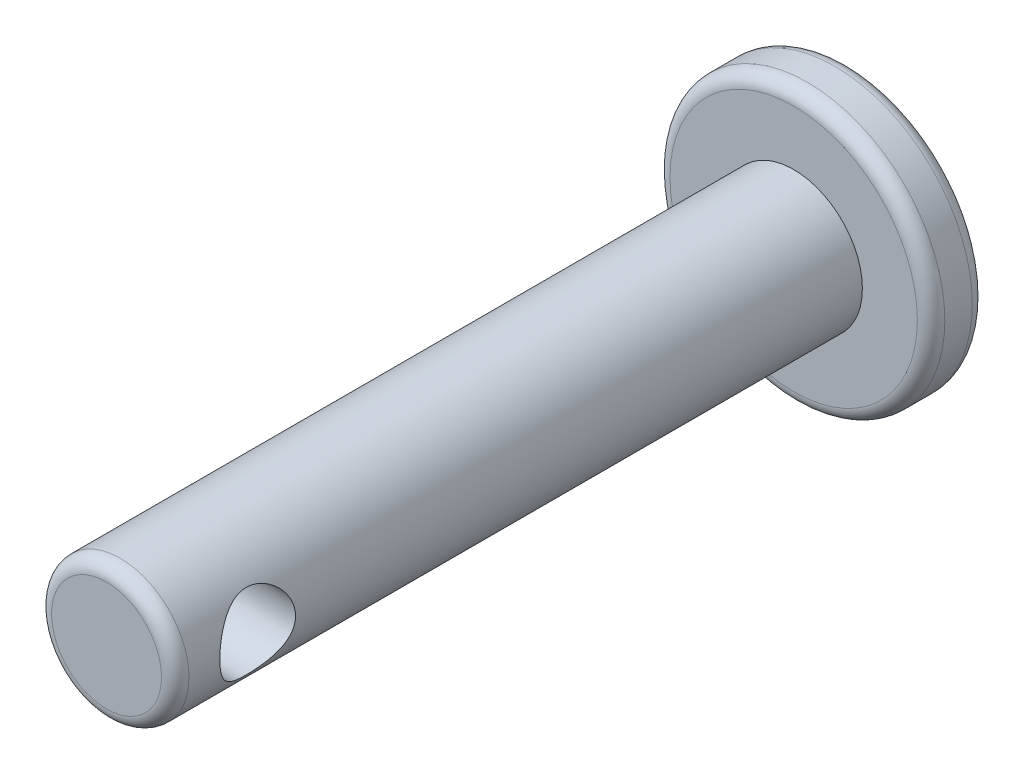
ISO-10303-21;
HEADER;
FILE_DESCRIPTION(('STEP AP214'),'2;1');
FILE_NAME('part.step','',(''),(''),'','','');
FILE_SCHEMA(('AUTOMOTIVE_DESIGN { 1 0 10303 214 1 1 1 1 }'));
ENDSEC;
DATA;
#1=APPLICATION_CONTEXT('core data for automotive mechanical design processes');
#2=APPLICATION_PROTOCOL_DEFINITION('international standard','automotive_design',2000,#1);
#3=PRODUCT_CONTEXT('',#1,'mechanical');
#4=PRODUCT('Part','Part','',(#3));
#5=PRODUCT_RELATED_PRODUCT_CATEGORY('part','',(#4));
#6=PRODUCT_DEFINITION_FORMATION('','',#4);
#7=PRODUCT_DEFINITION_CONTEXT('part definition',#1,'design');
#8=PRODUCT_DEFINITION('design','',#6,#7);
#9=PRODUCT_DEFINITION_SHAPE('','',#8);
#10=(LENGTH_UNIT() NAMED_UNIT(*) SI_UNIT(.MILLI.,.METRE.));
#11=(NAMED_UNIT(*) PLANE_ANGLE_UNIT() SI_UNIT($,.RADIAN.));
#12=(NAMED_UNIT(*) SI_UNIT($,.STERADIAN.) SOLID_ANGLE_UNIT());
#13=UNCERTAINTY_MEASURE_WITH_UNIT(LENGTH_MEASURE(1.E-05),#10,'distance_accuracy_value','');
#14=(GEOMETRIC_REPRESENTATION_CONTEXT(3) GLOBAL_UNCERTAINTY_ASSIGNED_CONTEXT((#13)) GLOBAL_UNIT_ASSIGNED_CONTEXT((#10,
#11,#12)) REPRESENTATION_CONTEXT('',''));
#15=CARTESIAN_POINT('',(0.,0.,0.));
#16=DIRECTION('',(0.,0.,1.));
#17=DIRECTION('',(1.,0.,0.));
#18=AXIS2_PLACEMENT_3D('',#15,#16,#17);
#19=CARTESIAN_POINT('',(0.,0.,31.75));
#20=DIRECTION('',(0.,0.,-1.));
#21=DIRECTION('',(-1.,0.,0.));
#22=AXIS2_PLACEMENT_3D('',#19,#20,#21);
#23=CYLINDRICAL_SURFACE('',#22,3.175);
#24=CARTESIAN_POINT('',(0.,0.,31.115));
#25=DIRECTION('',(0.,0.,1.));
#26=DIRECTION('',(1.,0.,0.));
#27=AXIS2_PLACEMENT_3D('',#24,#25,#26);
#28=CIRCLE('',#27,3.175);
#29=CARTESIAN_POINT('',(3.175,0.,31.115));
#30=VERTEX_POINT('',#29);
#31=EDGE_CURVE('E66',#30,#30,#28,.F.);
#32=ORIENTED_EDGE('',*,*,#31,.T.);
#33=EDGE_LOOP('',(#32));
#34=FACE_BOUND('',#33,.T.);
#35=CARTESIAN_POINT('',(-3.175,0.,29.69));
#36=CARTESIAN_POINT('',(-3.17499486148875,-0.0908343345345119,29.6899943142266));
#37=CARTESIAN_POINT('',(-3.17106237894338,-0.181741129095554,29.6828870197443));
#38=CARTESIAN_POINT('',(-3.15571837285608,-0.360794949485811,29.6548079730322));
#39=CARTESIAN_POINT('',(-3.14429673894018,-0.448938075564867,29.6338174781116));
#40=CARTESIAN_POINT('',(-3.11515124844675,-0.61961748666571,29.5790775292153));
#41=CARTESIAN_POINT('',(-3.09745340852565,-0.702175267011816,29.5453807105987));
#42=CARTESIAN_POINT('',(-3.05731508680075,-0.8602986592527,29.4664997517663));
#43=CARTESIAN_POINT('',(-3.03487439009447,-0.935863954089451,29.4213150910088));
#44=CARTESIAN_POINT('',(-2.98540925415886,-1.08371813160088,29.3172378223179));
#45=CARTESIAN_POINT('',(-2.95817540815769,-1.15542146387072,29.2576146474918));
#46=CARTESIAN_POINT('',(-2.90274653800907,-1.28836534351099,29.1279603481617));
#47=CARTESIAN_POINT('',(-2.8745506407085,-1.34959606574723,29.0579195640296));
#48=CARTESIAN_POINT('',(-2.81711347517585,-1.4659849714629,28.9011638574697));
#49=CARTESIAN_POINT('',(-2.78804528999922,-1.51994094194641,28.8134845250422));
#50=CARTESIAN_POINT('',(-2.73577622635886,-1.61213438096743,28.6285987648875));
#51=CARTESIAN_POINT('',(-2.71257071248348,-1.65038428280926,28.5313999488065));
#52=CARTESIAN_POINT('',(-2.67705484742213,-1.70735882688387,28.336328138979));
#53=CARTESIAN_POINT('',(-2.66414870738661,-1.72716450718922,28.2388858307223));
#54=CARTESIAN_POINT('',(-2.64929052379462,-1.74988358962694,28.0412849151578));
#55=CARTESIAN_POINT('',(-2.64732263124576,-1.75282143264469,27.9411304493474));
#56=CARTESIAN_POINT('',(-2.65410847820901,-1.74250953145329,27.7575279009294));
#57=CARTESIAN_POINT('',(-2.66126742374306,-1.73166839699995,27.6738688786424));
#58=CARTESIAN_POINT('',(-2.68263930216934,-1.6983696372325,27.5098272468928));
#59=CARTESIAN_POINT('',(-2.6968554769326,-1.67590667301184,27.4294461615931));
#60=CARTESIAN_POINT('',(-2.73098075921813,-1.61971069833494,27.2720337302982));
#61=CARTESIAN_POINT('',(-2.75100558760618,-1.58574597984232,27.195111418245));
#62=CARTESIAN_POINT('',(-2.79453478821848,-1.50771194619491,27.0476598054472));
#63=CARTESIAN_POINT('',(-2.81804065711077,-1.46363828021824,26.9771332756938));
#64=CARTESIAN_POINT('',(-2.87036597590955,-1.35852443625878,26.8327050359635));
#65=CARTESIAN_POINT('',(-2.89943694549374,-1.2959020684127,26.7600415879745));
#66=CARTESIAN_POINT('',(-2.95666921389051,-1.15940252909128,26.6256690662816));
#67=CARTESIAN_POINT('',(-2.98482987458003,-1.08551766148893,26.5639675462257));
#68=CARTESIAN_POINT('',(-3.0393649497108,-0.922368510349789,26.4492512620687));
#69=CARTESIAN_POINT('',(-3.06548977971676,-0.832402073084931,26.3971061304843));
#70=CARTESIAN_POINT('',(-3.11068497528208,-0.64318779398813,26.3091524507632));
#71=CARTESIAN_POINT('',(-3.12976199333834,-0.543948816052225,26.2733284894297));
#72=CARTESIAN_POINT('',(-3.15716082660671,-0.348908087964604,26.2224576302459));
#73=CARTESIAN_POINT('',(-3.16632047200006,-0.253650417076915,26.2057832277806));
#74=CARTESIAN_POINT('',(-3.1758654689012,-0.0612742076771245,26.1884137798865));
#75=CARTESIAN_POINT('',(-3.17625646716767,0.0358430929493048,26.1877084508271));
#76=CARTESIAN_POINT('',(-3.16863544823089,0.218973549595897,26.2015673489631));
#77=CARTESIAN_POINT('',(-3.16144517726059,0.305140280995927,26.2146382884209));
#78=CARTESIAN_POINT('',(-3.14059426840164,0.473832649268518,26.253148181577));
#79=CARTESIAN_POINT('',(-3.12693297737247,0.556357917677371,26.2785883837508));
#80=CARTESIAN_POINT('',(-3.09395511583406,0.717633813051058,26.3415114720942));
#81=CARTESIAN_POINT('',(-3.07451936269971,0.796259428096028,26.3792499639206));
#82=CARTESIAN_POINT('',(-3.0317156607883,0.94626570658803,26.4653577779123));
#83=CARTESIAN_POINT('',(-3.00834628302915,1.01764372201146,26.5137309653438));
#84=CARTESIAN_POINT('',(-2.95670949787944,1.15966503521653,26.6259370781459));
#85=CARTESIAN_POINT('',(-2.92818673647069,1.22932677337921,26.6908957770729));
#86=CARTESIAN_POINT('',(-2.87111305374919,1.3572968910084,26.8312708868849));
#87=CARTESIAN_POINT('',(-2.84256213412194,1.4155933429475,26.9066981436482));
#88=CARTESIAN_POINT('',(-2.78622625826442,1.52366886261597,27.0730931567083));
#89=CARTESIAN_POINT('',(-2.75867708376229,1.57242103564493,27.1648158399857));
#90=CARTESIAN_POINT('',(-2.71096594289495,1.65333547859534,27.3570622912219));
#91=CARTESIAN_POINT('',(-2.69079322105002,1.68552193086363,27.4575729782345));
#92=CARTESIAN_POINT('',(-2.66293247092364,1.72917068263101,27.6543249961799));
#93=CARTESIAN_POINT('',(-2.65422471529202,1.74233787768894,27.7500373802096));
#94=CARTESIAN_POINT('',(-2.64743355495655,1.7526470382738,27.9426648026175));
#95=CARTESIAN_POINT('',(-2.64934087980603,1.749802986845,28.0395787178719));
#96=CARTESIAN_POINT('',(-2.66240543812459,1.72983233210212,28.2176543799796));
#97=CARTESIAN_POINT('',(-2.67225802065448,1.71471830731483,28.299153409002));
#98=CARTESIAN_POINT('',(-2.69825190124201,1.67351473896551,28.4582728422434));
#99=CARTESIAN_POINT('',(-2.71439580334841,1.64742065027287,28.535891625355));
#100=CARTESIAN_POINT('',(-2.75231671408327,1.58330034444638,28.6903873343403));
#101=CARTESIAN_POINT('',(-2.77437717183065,1.54464359979401,28.7669304630569));
#102=CARTESIAN_POINT('',(-2.82134382352456,1.45709032279287,28.9129566073278));
#103=CARTESIAN_POINT('',(-2.84625152151811,1.40818836697509,28.9824358544516));
#104=CARTESIAN_POINT('',(-2.90079923116023,1.29255099628502,29.1238131376933));
#105=CARTESIAN_POINT('',(-2.93056594993979,1.22421929245562,29.1943638314129));
#106=CARTESIAN_POINT('',(-2.98810183596612,1.07618754952996,29.3234626149915));
#107=CARTESIAN_POINT('',(-3.01586954889191,0.996479357049844,29.3820020225296));
#108=CARTESIAN_POINT('',(-3.06753456849291,0.824153480581276,29.4871965777234));
#109=CARTESIAN_POINT('',(-3.09125894777407,0.731177300473371,29.5333545945618));
#110=CARTESIAN_POINT('',(-3.13078513350301,0.537155374305828,29.6087509368839));
#111=CARTESIAN_POINT('',(-3.14660717776965,0.436131017842751,29.6380325127567));
#112=CARTESIAN_POINT('',(-3.16326330516402,0.278272899920089,29.6686346155896));
#113=CARTESIAN_POINT('',(-3.16764671881302,0.223024440475059,29.6766288498162));
#114=CARTESIAN_POINT('',(-3.17351662400142,0.111859808204818,29.6873132478769));
#115=CARTESIAN_POINT('',(-3.17500316474007,0.0559436467357987,29.6900035017915));
#116=CARTESIAN_POINT('',(-3.175,0.,29.69));
#117=B_SPLINE_CURVE_WITH_KNOTS('',3,(#35,#36,#37,#38,#39,#40,#41,#42,#43,#44,#45,#46,#47,#48,
#49,#50,#51,#52,#53,#54,#55,#56,#57,#58,#59,#60,#61,#62,#63,#64,#65,#66,#67,#68,#69,#70,#71,#72,
#73,#74,#75,#76,#77,#78,#79,#80,#81,#82,#83,#84,#85,#86,#87,#88,#89,#90,#91,#92,#93,#94,#95,#96,
#97,#98,#99,#100,#101,#102,#103,#104,#105,#106,#107,#108,#109,#110,#111,#112,#113,#114,#115,
#116),.UNSPECIFIED.,.T.,.F.,(4,2,2,2,2,2,2,2,2,2,2,2,2,2,2,2,2,2,2,2,2,2,2,2,2,2,2,2,2,2,2,2,2,
2,2,2,2,2,2,2,4),(0.,0.272277820360698,0.544923975386455,0.816452897336008,1.08799412510768,
1.37826598247638,1.66880868920759,1.98812964124305,2.30719732146529,2.60610381295607,
2.90457709025153,3.15737066351596,3.41028046987245,3.6686225736785,3.92707607549681,
4.2265140987662,4.52615766524984,4.84606499591306,5.16566958678105,5.455435828957,
5.74501546457466,6.00614653400911,6.26730396584558,6.53427814513967,6.80134951925505,
7.09839519446488,7.39575095162455,7.71643302354713,8.03664563214355,8.3258529908513,
8.61480781634001,8.86412808337865,9.11355165670814,9.37818333414945,9.6429554542442,
9.94949416732581,10.2562536863531,10.5739311814169,10.8907908808705,11.058485981829,
11.2261782347014),.UNSPECIFIED.);
#118=CARTESIAN_POINT('',(-3.175,0.,29.69));
#119=VERTEX_POINT('',#118);
#120=EDGE_CURVE('E75',#119,#119,#117,.T.);
#121=ORIENTED_EDGE('',*,*,#120,.T.);
#122=EDGE_LOOP('',(#121));
#123=FACE_BOUND('',#122,.T.);
#124=CARTESIAN_POINT('',(3.175,0.,26.19));
#125=CARTESIAN_POINT('',(3.17499486148875,-0.0908343345345121,26.1900056857734));
#126=CARTESIAN_POINT('',(3.17106237894338,-0.181741129095554,26.1971129802557));
#127=CARTESIAN_POINT('',(3.15571837285608,-0.360794949485811,26.2251920269678));
#128=CARTESIAN_POINT('',(3.14429673894018,-0.448938075564867,26.2461825218884));
#129=CARTESIAN_POINT('',(3.11515124844675,-0.61961748666571,26.3009224707847));
#130=CARTESIAN_POINT('',(3.09745340852565,-0.702175267011816,26.3346192894013));
#131=CARTESIAN_POINT('',(3.05731508680075,-0.8602986592527,26.4135002482337));
#132=CARTESIAN_POINT('',(3.03487439009447,-0.935863954089452,26.4586849089912));
#133=CARTESIAN_POINT('',(2.98540925415886,-1.08371813160089,26.5627621776821));
#134=CARTESIAN_POINT('',(2.95817540815769,-1.15542146387073,26.6223853525082));
#135=CARTESIAN_POINT('',(2.90274653800907,-1.28836534351099,26.7520396518383));
#136=CARTESIAN_POINT('',(2.8745506407085,-1.34959606574723,26.8220804359704));
#137=CARTESIAN_POINT('',(2.81711347517585,-1.4659849714629,26.9788361425303));
#138=CARTESIAN_POINT('',(2.78804528999922,-1.51994094194641,27.0665154749578));
#139=CARTESIAN_POINT('',(2.73577622635886,-1.61213438096743,27.2514012351125));
#140=CARTESIAN_POINT('',(2.71257071248348,-1.65038428280926,27.3486000511935));
#141=CARTESIAN_POINT('',(2.67705484742213,-1.70735882688387,27.543671861021));
#142=CARTESIAN_POINT('',(2.66414870738661,-1.72716450718922,27.6411141692777));
#143=CARTESIAN_POINT('',(2.64929052379462,-1.74988358962694,27.8387150848422));
#144=CARTESIAN_POINT('',(2.64732263124576,-1.75282143264469,27.9388695506526));
#145=CARTESIAN_POINT('',(2.65410847820901,-1.74250953145329,28.1224720990706));
#146=CARTESIAN_POINT('',(2.66126742374306,-1.73166839699995,28.2061311213576));
#147=CARTESIAN_POINT('',(2.68263930216934,-1.6983696372325,28.3701727531072));
#148=CARTESIAN_POINT('',(2.6968554769326,-1.67590667301184,28.4505538384069));
#149=CARTESIAN_POINT('',(2.73098075921813,-1.61971069833494,28.6079662697018));
#150=CARTESIAN_POINT('',(2.75100558760618,-1.58574597984231,28.684888581755));
#151=CARTESIAN_POINT('',(2.79453478821848,-1.50771194619491,28.8323401945528));
#152=CARTESIAN_POINT('',(2.81804065711077,-1.46363828021824,28.9028667243062));
#153=CARTESIAN_POINT('',(2.87036597590955,-1.35852443625878,29.0472949640365));
#154=CARTESIAN_POINT('',(2.89943694549374,-1.2959020684127,29.1199584120255));
#155=CARTESIAN_POINT('',(2.95666921389051,-1.15940252909128,29.2543309337184));
#156=CARTESIAN_POINT('',(2.98482987458003,-1.08551766148893,29.3160324537743));
#157=CARTESIAN_POINT('',(3.0393649497108,-0.922368510349789,29.4307487379313));
#158=CARTESIAN_POINT('',(3.06548977971676,-0.832402073084931,29.4828938695157));
#159=CARTESIAN_POINT('',(3.11068497528208,-0.64318779398813,29.5708475492368));
#160=CARTESIAN_POINT('',(3.12976199333834,-0.543948816052225,29.6066715105703));
#161=CARTESIAN_POINT('',(3.15716082660671,-0.348908087964604,29.6575423697541));
#162=CARTESIAN_POINT('',(3.16632047200006,-0.253650417076915,29.6742167722194));
#163=CARTESIAN_POINT('',(3.1758654689012,-0.0612742076771245,29.6915862201135));
#164=CARTESIAN_POINT('',(3.17625646716767,0.0358430929493048,29.6922915491729));
#165=CARTESIAN_POINT('',(3.16863544823089,0.218973549595897,29.6784326510369));
#166=CARTESIAN_POINT('',(3.16144517726059,0.305140280995927,29.6653617115791));
#167=CARTESIAN_POINT('',(3.14059426840164,0.473832649268518,29.626851818423));
#168=CARTESIAN_POINT('',(3.12693297737247,0.556357917677371,29.6014116162492));
#169=CARTESIAN_POINT('',(3.09395511583406,0.717633813051058,29.5384885279058));
#170=CARTESIAN_POINT('',(3.07451936269971,0.796259428096028,29.5007500360794));
#171=CARTESIAN_POINT('',(3.0317156607883,0.94626570658803,29.4146422220877));
#172=CARTESIAN_POINT('',(3.00834628302915,1.01764372201146,29.3662690346562));
#173=CARTESIAN_POINT('',(2.95670949787944,1.15966503521653,29.2540629218541));
#174=CARTESIAN_POINT('',(2.92818673647069,1.22932677337921,29.1891042229271));
#175=CARTESIAN_POINT('',(2.87111305374919,1.3572968910084,29.0487291131151));
#176=CARTESIAN_POINT('',(2.84256213412194,1.4155933429475,28.9733018563518));
#177=CARTESIAN_POINT('',(2.78622625826442,1.52366886261597,28.8069068432918));
#178=CARTESIAN_POINT('',(2.75867708376229,1.57242103564493,28.7151841600143));
#179=CARTESIAN_POINT('',(2.71096594289495,1.65333547859534,28.5229377087781));
#180=CARTESIAN_POINT('',(2.69079322105002,1.68552193086363,28.4224270217655));
#181=CARTESIAN_POINT('',(2.66293247092364,1.72917068263101,28.2256750038201));
#182=CARTESIAN_POINT('',(2.65422471529202,1.74233787768894,28.1299626197904));
#183=CARTESIAN_POINT('',(2.64743355495655,1.7526470382738,27.9373351973825));
#184=CARTESIAN_POINT('',(2.64934087980602,1.749802986845,27.8404212821281));
#185=CARTESIAN_POINT('',(2.66240543812459,1.72983233210212,27.6623456200204));
#186=CARTESIAN_POINT('',(2.67225802065448,1.71471830731483,27.580846590998));
#187=CARTESIAN_POINT('',(2.69825190124201,1.6735147389655,27.4217271577566));
#188=CARTESIAN_POINT('',(2.71439580334841,1.64742065027287,27.344108374645));
#189=CARTESIAN_POINT('',(2.75231671408327,1.58330034444638,27.1896126656597));
#190=CARTESIAN_POINT('',(2.77437717183065,1.54464359979401,27.1130695369431));
#191=CARTESIAN_POINT('',(2.82134382352456,1.45709032279287,26.9670433926722));
#192=CARTESIAN_POINT('',(2.84625152151811,1.40818836697509,26.8975641455484));
#193=CARTESIAN_POINT('',(2.90079923116023,1.29255099628502,26.7561868623067));
#194=CARTESIAN_POINT('',(2.93056594993979,1.22421929245562,26.6856361685871));
#195=CARTESIAN_POINT('',(2.98810183596612,1.07618754952996,26.5565373850085));
#196=CARTESIAN_POINT('',(3.01586954889191,0.996479357049844,26.4979979774704));
#197=CARTESIAN_POINT('',(3.06753456849291,0.824153480581275,26.3928034222766));
#198=CARTESIAN_POINT('',(3.09125894777407,0.73117730047337,26.3466454054383));
#199=CARTESIAN_POINT('',(3.13078513350301,0.537155374305827,26.2712490631161));
#200=CARTESIAN_POINT('',(3.14660717776965,0.43613101784275,26.2419674872433));
#201=CARTESIAN_POINT('',(3.16326330516402,0.278272899920089,26.2113653844104));
#202=CARTESIAN_POINT('',(3.16764671881302,0.22302444047506,26.2033711501838));
#203=CARTESIAN_POINT('',(3.17351662400142,0.111859808204819,26.1926867521231));
#204=CARTESIAN_POINT('',(3.17500316474007,0.0559436467357989,26.1899964982085));
#205=CARTESIAN_POINT('',(3.175,0.,26.19));
#206=B_SPLINE_CURVE_WITH_KNOTS('',3,(#124,#125,#126,#127,#128,#129,#130,#131,#132,#133,#134,
#135,#136,#137,#138,#139,#140,#141,#142,#143,#144,#145,#146,#147,#148,#149,#150,#151,#152,#153,
#154,#155,#156,#157,#158,#159,#160,#161,#162,#163,#164,#165,#166,#167,#168,#169,#170,#171,#172,
#173,#174,#175,#176,#177,#178,#179,#180,#181,#182,#183,#184,#185,#186,#187,#188,#189,#190,#191,
#192,#193,#194,#195,#196,#197,#198,#199,#200,#201,#202,#203,#204,#205),.UNSPECIFIED.,.T.,.F.,(4,
2,2,2,2,2,2,2,2,2,2,2,2,2,2,2,2,2,2,2,2,2,2,2,2,2,2,2,2,2,2,2,2,2,2,2,2,2,2,2,4),(0.,
0.272277820360698,0.544923975386455,0.816452897336008,1.08799412510768,1.37826598247639,
1.66880868920759,1.98812964124305,2.30719732146529,2.60610381295607,2.90457709025153,
3.15737066351596,3.41028046987245,3.6686225736785,3.92707607549681,4.2265140987662,
4.52615766524984,4.84606499591306,5.16566958678105,5.455435828957,5.74501546457466,
6.00614653400911,6.26730396584558,6.53427814513967,6.80134951925505,7.09839519446488,
7.39575095162455,7.71643302354714,8.03664563214355,8.3258529908513,8.61480781634001,
8.86412808337865,9.11355165670814,9.37818333414944,9.64295545424419,9.9494941673258,
10.2562536863531,10.5739311814169,10.8907908808705,11.058485981829,11.2261782347014),.UNSPECIFIED.);
#207=CARTESIAN_POINT('',(3.175,0.,26.19));
#208=VERTEX_POINT('',#207);
#209=EDGE_CURVE('E84',#208,#208,#206,.T.);
#210=ORIENTED_EDGE('',*,*,#209,.T.);
#211=EDGE_LOOP('',(#210));
#212=FACE_BOUND('',#211,.T.);
#213=CARTESIAN_POINT('',(0.,0.,0.));
#214=DIRECTION('',(0.,0.,1.));
#215=DIRECTION('',(1.,0.,0.));
#216=AXIS2_PLACEMENT_3D('',#213,#214,#215);
#217=CIRCLE('',#216,3.175);
#218=CARTESIAN_POINT('',(3.175,0.,0.));
#219=VERTEX_POINT('',#218);
#220=EDGE_CURVE('E74',#219,#219,#217,.T.);
#221=ORIENTED_EDGE('',*,*,#220,.T.);
#222=EDGE_LOOP('',(#221));
#223=FACE_BOUND('',#222,.T.);
#224=ADVANCED_FACE('F42',(#34,#123,#212,#223),#23,.T.);
#225=CARTESIAN_POINT('',(0.,0.,31.75));
#226=DIRECTION('',(0.,0.,1.));
#227=DIRECTION('',(1.,0.,0.));
#228=AXIS2_PLACEMENT_3D('',#225,#226,#227);
#229=PLANE('',#228);
#230=CARTESIAN_POINT('',(0.,0.,31.75));
#231=DIRECTION('',(0.,0.,1.));
#232=DIRECTION('',(1.,0.,0.));
#233=AXIS2_PLACEMENT_3D('',#230,#231,#232);
#234=CIRCLE('',#233,2.54);
#235=CARTESIAN_POINT('',(2.54,0.,31.75));
#236=VERTEX_POINT('',#235);
#237=EDGE_CURVE('E70',#236,#236,#234,.T.);
#238=ORIENTED_EDGE('',*,*,#237,.T.);
#239=EDGE_LOOP('',(#238));
#240=FACE_BOUND('',#239,.T.);
#241=ADVANCED_FACE('F108',(#240),#229,.T.);
#242=CARTESIAN_POINT('',(0.,0.,-2.54));
#243=DIRECTION('',(0.,0.,1.));
#244=DIRECTION('',(1.,0.,0.));
#245=AXIS2_PLACEMENT_3D('',#242,#243,#244);
#246=CYLINDRICAL_SURFACE('',#245,6.35);
#247=CARTESIAN_POINT('',(0.,0.,-1.905));
#248=DIRECTION('',(0.,0.,-1.));
#249=DIRECTION('',(-1.,0.,0.));
#250=AXIS2_PLACEMENT_3D('',#247,#248,#249);
#251=CIRCLE('',#250,6.35);
#252=CARTESIAN_POINT('',(-6.35,0.,-1.905));
#253=VERTEX_POINT('',#252);
#254=EDGE_CURVE('E50',#253,#253,#251,.F.);
#255=ORIENTED_EDGE('',*,*,#254,.T.);
#256=EDGE_LOOP('',(#255));
#257=FACE_BOUND('',#256,.T.);
#258=CARTESIAN_POINT('',(0.,0.,-0.635));
#259=DIRECTION('',(0.,0.,-1.));
#260=DIRECTION('',(-1.,0.,0.));
#261=AXIS2_PLACEMENT_3D('',#258,#259,#260);
#262=CIRCLE('',#261,6.35);
#263=CARTESIAN_POINT('',(-6.35,0.,-0.635));
#264=VERTEX_POINT('',#263);
#265=EDGE_CURVE('E55',#264,#264,#262,.T.);
#266=ORIENTED_EDGE('',*,*,#265,.T.);
#267=EDGE_LOOP('',(#266));
#268=FACE_BOUND('',#267,.T.);
#269=ADVANCED_FACE('F103',(#257,#268),#246,.T.);
#270=CARTESIAN_POINT('',(0.,0.,-2.54));
#271=DIRECTION('',(0.,0.,-1.));
#272=DIRECTION('',(-1.,0.,0.));
#273=AXIS2_PLACEMENT_3D('',#270,#271,#272);
#274=PLANE('',#273);
#275=CARTESIAN_POINT('',(0.,0.,-2.54));
#276=DIRECTION('',(0.,0.,-1.));
#277=DIRECTION('',(-1.,0.,0.));
#278=AXIS2_PLACEMENT_3D('',#275,#276,#277);
#279=CIRCLE('',#278,5.715);
#280=CARTESIAN_POINT('',(-5.715,0.,-2.54));
#281=VERTEX_POINT('',#280);
#282=EDGE_CURVE('E60',#281,#281,#279,.T.);
#283=ORIENTED_EDGE('',*,*,#282,.T.);
#284=EDGE_LOOP('',(#283));
#285=FACE_BOUND('',#284,.T.);
#286=ADVANCED_FACE('F99',(#285),#274,.T.);
#287=CARTESIAN_POINT('',(0.,0.,0.));
#288=DIRECTION('',(0.,0.,-1.));
#289=DIRECTION('',(-1.,0.,0.));
#290=AXIS2_PLACEMENT_3D('',#287,#288,#289);
#291=PLANE('',#290);
#292=CARTESIAN_POINT('',(0.,0.,0.));
#293=DIRECTION('',(0.,0.,-1.));
#294=DIRECTION('',(-1.,0.,0.));
#295=AXIS2_PLACEMENT_3D('',#292,#293,#294);
#296=CIRCLE('',#295,5.715);
#297=CARTESIAN_POINT('',(-5.715,0.,0.));
#298=VERTEX_POINT('',#297);
#299=EDGE_CURVE('E10',#298,#298,#296,.F.);
#300=ORIENTED_EDGE('',*,*,#299,.T.);
#301=EDGE_LOOP('',(#300));
#302=FACE_BOUND('',#301,.T.);
#303=ORIENTED_EDGE('',*,*,#220,.F.);
#304=EDGE_LOOP('',(#303));
#305=FACE_BOUND('',#304,.T.);
#306=ADVANCED_FACE('F97',(#302,#305),#291,.F.);
#307=CARTESIAN_POINT('',(-6.35,0.,27.94));
#308=DIRECTION('',(1.,0.,0.));
#309=DIRECTION('',(0.,0.,-1.));
#310=AXIS2_PLACEMENT_3D('',#307,#308,#309);
#311=CYLINDRICAL_SURFACE('',#310,1.75);
#312=ORIENTED_EDGE('',*,*,#209,.F.);
#313=EDGE_LOOP('',(#312));
#314=FACE_BOUND('',#313,.T.);
#315=ORIENTED_EDGE('',*,*,#120,.F.);
#316=EDGE_LOOP('',(#315));
#317=FACE_BOUND('',#316,.T.);
#318=ADVANCED_FACE('F92',(#314,#317),#311,.F.);
#319=CARTESIAN_POINT('',(0.,0.,31.115));
#320=DIRECTION('',(0.,0.,1.));
#321=DIRECTION('',(1.,0.,0.));
#322=AXIS2_PLACEMENT_3D('',#319,#320,#321);
#323=TOROIDAL_SURFACE('',#322,2.54,0.635);
#324=ORIENTED_EDGE('',*,*,#31,.F.);
#325=EDGE_LOOP('',(#324));
#326=FACE_BOUND('',#325,.T.);
#327=ORIENTED_EDGE('',*,*,#237,.F.);
#328=EDGE_LOOP('',(#327));
#329=FACE_BOUND('',#328,.T.);
#330=ADVANCED_FACE('F96',(#326,#329),#323,.T.);
#331=CARTESIAN_POINT('',(0.,0.,-1.905));
#332=DIRECTION('',(0.,0.,-1.));
#333=DIRECTION('',(-1.,0.,0.));
#334=AXIS2_PLACEMENT_3D('',#331,#332,#333);
#335=TOROIDAL_SURFACE('',#334,5.715,0.635);
#336=ORIENTED_EDGE('',*,*,#254,.F.);
#337=EDGE_LOOP('',(#336));
#338=FACE_BOUND('',#337,.T.);
#339=ORIENTED_EDGE('',*,*,#282,.F.);
#340=EDGE_LOOP('',(#339));
#341=FACE_BOUND('',#340,.T.);
#342=ADVANCED_FACE('F118',(#338,#341),#335,.T.);
#343=CARTESIAN_POINT('',(0.,0.,-0.635));
#344=DIRECTION('',(0.,0.,-1.));
#345=DIRECTION('',(-1.,0.,0.));
#346=AXIS2_PLACEMENT_3D('',#343,#344,#345);
#347=TOROIDAL_SURFACE('',#346,5.715,0.635);
#348=ORIENTED_EDGE('',*,*,#299,.F.);
#349=EDGE_LOOP('',(#348));
#350=FACE_BOUND('',#349,.T.);
#351=ORIENTED_EDGE('',*,*,#265,.F.);
#352=EDGE_LOOP('',(#351));
#353=FACE_BOUND('',#352,.T.);
#354=ADVANCED_FACE('F44',(#350,#353),#347,.T.);
#355=CLOSED_SHELL('',(#224,#241,#269,#286,#306,#318,#330,#342,#354));
#356=MANIFOLD_SOLID_BREP('B2',#355);
#357=ADVANCED_BREP_SHAPE_REPRESENTATION('',(#18,#356),#14);
#358=SHAPE_DEFINITION_REPRESENTATION(#9,#357);
ENDSEC;
END-ISO-10303-21;
